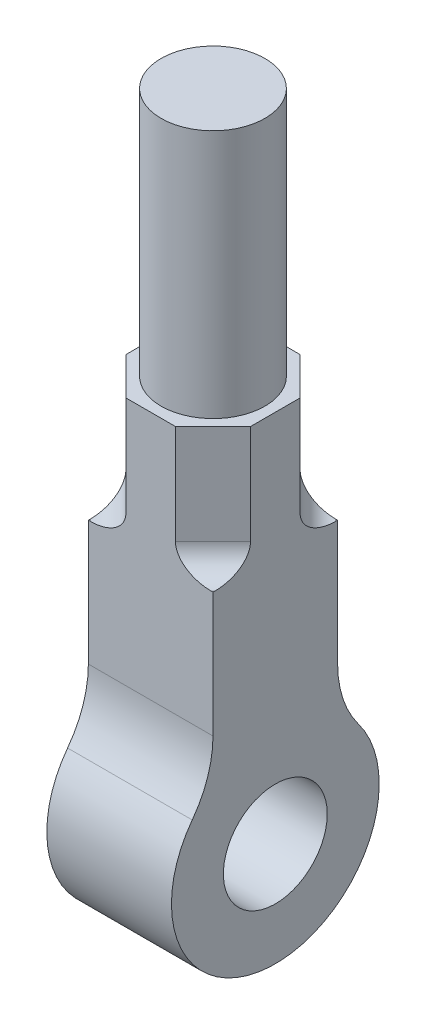
ISO-10303-21;
HEADER;
FILE_DESCRIPTION(('STEP AP214'),'2;1');
FILE_NAME('part.step','',(''),(''),'','','');
FILE_SCHEMA(('AUTOMOTIVE_DESIGN { 1 0 10303 214 1 1 1 1 }'));
ENDSEC;
DATA;
#1=APPLICATION_CONTEXT('core data for automotive mechanical design processes');
#2=APPLICATION_PROTOCOL_DEFINITION('international standard','automotive_design',2000,#1);
#3=PRODUCT_CONTEXT('',#1,'mechanical');
#4=PRODUCT('Part','Part','',(#3));
#5=PRODUCT_RELATED_PRODUCT_CATEGORY('part','',(#4));
#6=PRODUCT_DEFINITION_FORMATION('','',#4);
#7=PRODUCT_DEFINITION_CONTEXT('part definition',#1,'design');
#8=PRODUCT_DEFINITION('design','',#6,#7);
#9=PRODUCT_DEFINITION_SHAPE('','',#8);
#10=(LENGTH_UNIT() NAMED_UNIT(*) SI_UNIT(.MILLI.,.METRE.));
#11=(NAMED_UNIT(*) PLANE_ANGLE_UNIT() SI_UNIT($,.RADIAN.));
#12=(NAMED_UNIT(*) SI_UNIT($,.STERADIAN.) SOLID_ANGLE_UNIT());
#13=UNCERTAINTY_MEASURE_WITH_UNIT(LENGTH_MEASURE(1.E-05),#10,'distance_accuracy_value','');
#14=(GEOMETRIC_REPRESENTATION_CONTEXT(3) GLOBAL_UNCERTAINTY_ASSIGNED_CONTEXT((#13)) GLOBAL_UNIT_ASSIGNED_CONTEXT((#10,
#11,#12)) REPRESENTATION_CONTEXT('',''));
#15=CARTESIAN_POINT('',(0.,0.,0.));
#16=DIRECTION('',(0.,0.,1.));
#17=DIRECTION('',(1.,0.,0.));
#18=AXIS2_PLACEMENT_3D('',#15,#16,#17);
#19=CARTESIAN_POINT('',(60.,60.,-80.));
#20=DIRECTION('',(-1.,0.,0.));
#21=DIRECTION('',(0.,0.,1.));
#22=AXIS2_PLACEMENT_3D('',#19,#20,#21);
#23=PLANE('',#22);
#24=DIRECTION('',(0.,0.,-1.));
#25=VECTOR('',#24,1.);
#26=CARTESIAN_POINT('',(60.,120.,0.));
#27=LINE('',#26,#25);
#28=CARTESIAN_POINT('',(60.,120.,-28.9105627484772));
#29=VERTEX_POINT('',#28);
#30=CARTESIAN_POINT('',(60.,120.,-30.));
#31=VERTEX_POINT('',#30);
#32=EDGE_CURVE('E297',#29,#31,#27,.T.);
#33=ORIENTED_EDGE('',*,*,#32,.F.);
#34=CARTESIAN_POINT('',(60.,132.,-28.9105627484772));
#35=DIRECTION('',(-1.,0.,0.));
#36=DIRECTION('',(0.,0.,1.));
#37=AXIS2_PLACEMENT_3D('',#34,#35,#36);
#38=ELLIPSE('',#37,16.9705627484771,12.);
#39=CARTESIAN_POINT('',(60.,132.,-11.94));
#40=VERTEX_POINT('',#39);
#41=EDGE_CURVE('E254',#29,#40,#38,.T.);
#42=ORIENTED_EDGE('',*,*,#41,.T.);
#43=DIRECTION('',(0.,1.,0.));
#44=VECTOR('',#43,1.);
#45=CARTESIAN_POINT('',(60.,120.,-11.94));
#46=LINE('',#45,#44);
#47=CARTESIAN_POINT('',(60.,180.,-11.94));
#48=VERTEX_POINT('',#47);
#49=EDGE_CURVE('E288',#40,#48,#46,.T.);
#50=ORIENTED_EDGE('',*,*,#49,.T.);
#51=DIRECTION('',(0.,0.,1.));
#52=VECTOR('',#51,1.);
#53=CARTESIAN_POINT('',(60.,180.,30.));
#54=LINE('',#53,#52);
#55=CARTESIAN_POINT('',(60.,180.,11.94));
#56=VERTEX_POINT('',#55);
#57=EDGE_CURVE('E341',#48,#56,#54,.T.);
#58=ORIENTED_EDGE('',*,*,#57,.T.);
#59=DIRECTION('',(0.,1.,0.));
#60=VECTOR('',#59,1.);
#61=CARTESIAN_POINT('',(60.,120.,11.94));
#62=LINE('',#61,#60);
#63=CARTESIAN_POINT('',(60.,132.,11.94));
#64=VERTEX_POINT('',#63);
#65=EDGE_CURVE('E316',#64,#56,#62,.T.);
#66=ORIENTED_EDGE('',*,*,#65,.F.);
#67=CARTESIAN_POINT('',(60.,132.,28.9105627484771));
#68=DIRECTION('',(-1.,0.,0.));
#69=DIRECTION('',(0.,0.,1.));
#70=AXIS2_PLACEMENT_3D('',#67,#68,#69);
#71=ELLIPSE('',#70,16.9705627484771,12.);
#72=CARTESIAN_POINT('',(60.,120.,28.9105627484771));
#73=VERTEX_POINT('',#72);
#74=EDGE_CURVE('E11',#64,#73,#71,.T.);
#75=ORIENTED_EDGE('',*,*,#74,.T.);
#76=DIRECTION('',(0.,0.,-1.));
#77=VECTOR('',#76,1.);
#78=CARTESIAN_POINT('',(60.,120.,0.));
#79=LINE('',#78,#77);
#80=CARTESIAN_POINT('',(60.,120.,30.));
#81=VERTEX_POINT('',#80);
#82=EDGE_CURVE('E309',#81,#73,#79,.T.);
#83=ORIENTED_EDGE('',*,*,#82,.F.);
#84=DIRECTION('',(0.,-1.,0.));
#85=VECTOR('',#84,1.);
#86=CARTESIAN_POINT('',(60.,60.,30.));
#87=LINE('',#86,#85);
#88=CARTESIAN_POINT('',(60.,60.,30.));
#89=VERTEX_POINT('',#88);
#90=EDGE_CURVE('E345',#81,#89,#87,.T.);
#91=ORIENTED_EDGE('',*,*,#90,.T.);
#92=CARTESIAN_POINT('',(60.,60.,80.));
#93=DIRECTION('',(-1.,0.,0.));
#94=DIRECTION('',(0.,0.,-1.));
#95=AXIS2_PLACEMENT_3D('',#92,#93,#94);
#96=CIRCLE('',#95,50.);
#97=CARTESIAN_POINT('',(60.,30.,40.));
#98=VERTEX_POINT('',#97);
#99=EDGE_CURVE('E348',#89,#98,#96,.T.);
#100=ORIENTED_EDGE('',*,*,#99,.T.);
#101=CARTESIAN_POINT('',(60.,0.,0.));
#102=DIRECTION('',(1.,0.,0.));
#103=DIRECTION('',(0.,0.,-1.));
#104=AXIS2_PLACEMENT_3D('',#101,#102,#103);
#105=CIRCLE('',#104,50.);
#106=CARTESIAN_POINT('',(60.,30.,-40.));
#107=VERTEX_POINT('',#106);
#108=EDGE_CURVE('E351',#98,#107,#105,.T.);
#109=ORIENTED_EDGE('',*,*,#108,.T.);
#110=CARTESIAN_POINT('',(60.,60.,-80.));
#111=DIRECTION('',(-1.,0.,0.));
#112=DIRECTION('',(0.,0.,1.));
#113=AXIS2_PLACEMENT_3D('',#110,#111,#112);
#114=CIRCLE('',#113,50.);
#115=CARTESIAN_POINT('',(60.,60.,-30.));
#116=VERTEX_POINT('',#115);
#117=EDGE_CURVE('E332',#107,#116,#114,.T.);
#118=ORIENTED_EDGE('',*,*,#117,.T.);
#119=DIRECTION('',(0.,1.,0.));
#120=VECTOR('',#119,1.);
#121=CARTESIAN_POINT('',(60.,60.,-30.));
#122=LINE('',#121,#120);
#123=EDGE_CURVE('E336',#116,#31,#122,.T.);
#124=ORIENTED_EDGE('',*,*,#123,.T.);
#125=EDGE_LOOP('',(#33,#42,#50,#58,#66,#75,#83,#91,#100,#109,#118,#124));
#126=FACE_BOUND('',#125,.T.);
#127=CARTESIAN_POINT('',(60.,0.,0.));
#128=DIRECTION('',(1.,0.,0.));
#129=DIRECTION('',(0.,0.,-1.));
#130=AXIS2_PLACEMENT_3D('',#127,#128,#129);
#131=CIRCLE('',#130,25.);
#132=CARTESIAN_POINT('',(60.,0.,-25.));
#133=VERTEX_POINT('',#132);
#134=EDGE_CURVE('E324',#133,#133,#131,.T.);
#135=ORIENTED_EDGE('',*,*,#134,.F.);
#136=EDGE_LOOP('',(#135));
#137=FACE_BOUND('',#136,.T.);
#138=ADVANCED_FACE('F44',(#126,#137),#23,.F.);
#139=CARTESIAN_POINT('',(0.,60.,-80.));
#140=DIRECTION('',(-1.,0.,0.));
#141=DIRECTION('',(0.,0.,1.));
#142=AXIS2_PLACEMENT_3D('',#139,#140,#141);
#143=PLANE('',#142);
#144=DIRECTION('',(0.,1.,0.));
#145=VECTOR('',#144,1.);
#146=CARTESIAN_POINT('',(0.,120.,-11.94));
#147=LINE('',#146,#145);
#148=CARTESIAN_POINT('',(0.,132.,-11.94));
#149=VERTEX_POINT('',#148);
#150=CARTESIAN_POINT('',(0.,180.,-11.94));
#151=VERTEX_POINT('',#150);
#152=EDGE_CURVE('E284',#149,#151,#147,.T.);
#153=ORIENTED_EDGE('',*,*,#152,.F.);
#154=CARTESIAN_POINT('',(0.,132.,-28.9105627484771));
#155=DIRECTION('',(-1.,0.,0.));
#156=DIRECTION('',(0.,0.,-1.));
#157=AXIS2_PLACEMENT_3D('',#154,#155,#156);
#158=ELLIPSE('',#157,16.9705627484771,12.);
#159=CARTESIAN_POINT('',(0.,120.,-28.9105627484771));
#160=VERTEX_POINT('',#159);
#161=EDGE_CURVE('E245',#149,#160,#158,.F.);
#162=ORIENTED_EDGE('',*,*,#161,.T.);
#163=DIRECTION('',(0.,0.,1.));
#164=VECTOR('',#163,1.);
#165=CARTESIAN_POINT('',(0.,120.,0.));
#166=LINE('',#165,#164);
#167=CARTESIAN_POINT('',(0.,120.,-30.));
#168=VERTEX_POINT('',#167);
#169=EDGE_CURVE('E276',#168,#160,#166,.T.);
#170=ORIENTED_EDGE('',*,*,#169,.F.);
#171=DIRECTION('',(0.,1.,0.));
#172=VECTOR('',#171,1.);
#173=CARTESIAN_POINT('',(0.,60.,-30.));
#174=LINE('',#173,#172);
#175=CARTESIAN_POINT('',(0.,60.,-30.));
#176=VERTEX_POINT('',#175);
#177=EDGE_CURVE('E358',#176,#168,#174,.T.);
#178=ORIENTED_EDGE('',*,*,#177,.F.);
#179=CARTESIAN_POINT('',(0.,60.,-80.));
#180=DIRECTION('',(-1.,0.,0.));
#181=DIRECTION('',(0.,0.,1.));
#182=AXIS2_PLACEMENT_3D('',#179,#180,#181);
#183=CIRCLE('',#182,50.);
#184=CARTESIAN_POINT('',(0.,30.,-40.));
#185=VERTEX_POINT('',#184);
#186=EDGE_CURVE('E328',#185,#176,#183,.T.);
#187=ORIENTED_EDGE('',*,*,#186,.F.);
#188=CARTESIAN_POINT('',(0.,0.,0.));
#189=DIRECTION('',(1.,0.,0.));
#190=DIRECTION('',(0.,0.,-1.));
#191=AXIS2_PLACEMENT_3D('',#188,#189,#190);
#192=CIRCLE('',#191,50.);
#193=CARTESIAN_POINT('',(0.,30.,40.));
#194=VERTEX_POINT('',#193);
#195=EDGE_CURVE('E337',#194,#185,#192,.T.);
#196=ORIENTED_EDGE('',*,*,#195,.F.);
#197=CARTESIAN_POINT('',(0.,60.,80.));
#198=DIRECTION('',(-1.,0.,0.));
#199=DIRECTION('',(0.,0.,-1.));
#200=AXIS2_PLACEMENT_3D('',#197,#198,#199);
#201=CIRCLE('',#200,50.);
#202=CARTESIAN_POINT('',(0.,60.,30.));
#203=VERTEX_POINT('',#202);
#204=EDGE_CURVE('E367',#203,#194,#201,.T.);
#205=ORIENTED_EDGE('',*,*,#204,.F.);
#206=DIRECTION('',(0.,-1.,0.));
#207=VECTOR('',#206,1.);
#208=CARTESIAN_POINT('',(0.,60.,30.));
#209=LINE('',#208,#207);
#210=CARTESIAN_POINT('',(0.,120.,30.));
#211=VERTEX_POINT('',#210);
#212=EDGE_CURVE('E364',#211,#203,#209,.T.);
#213=ORIENTED_EDGE('',*,*,#212,.F.);
#214=DIRECTION('',(0.,0.,1.));
#215=VECTOR('',#214,1.);
#216=CARTESIAN_POINT('',(0.,120.,0.));
#217=LINE('',#216,#215);
#218=CARTESIAN_POINT('',(0.,120.,28.9105627484771));
#219=VERTEX_POINT('',#218);
#220=EDGE_CURVE('E180',#219,#211,#217,.T.);
#221=ORIENTED_EDGE('',*,*,#220,.F.);
#222=CARTESIAN_POINT('',(0.,132.,28.9105627484771));
#223=DIRECTION('',(-1.,0.,0.));
#224=DIRECTION('',(0.,0.,-1.));
#225=AXIS2_PLACEMENT_3D('',#222,#223,#224);
#226=ELLIPSE('',#225,16.9705627484771,12.);
#227=CARTESIAN_POINT('',(0.,132.,11.94));
#228=VERTEX_POINT('',#227);
#229=EDGE_CURVE('E248',#219,#228,#226,.F.);
#230=ORIENTED_EDGE('',*,*,#229,.T.);
#231=DIRECTION('',(0.,1.,0.));
#232=VECTOR('',#231,1.);
#233=CARTESIAN_POINT('',(0.,120.,11.94));
#234=LINE('',#233,#232);
#235=CARTESIAN_POINT('',(0.,180.,11.94));
#236=VERTEX_POINT('',#235);
#237=EDGE_CURVE('E179',#228,#236,#234,.T.);
#238=ORIENTED_EDGE('',*,*,#237,.T.);
#239=DIRECTION('',(0.,0.,1.));
#240=VECTOR('',#239,1.);
#241=CARTESIAN_POINT('',(0.,180.,30.));
#242=LINE('',#241,#240);
#243=EDGE_CURVE('E190',#151,#236,#242,.T.);
#244=ORIENTED_EDGE('',*,*,#243,.F.);
#245=EDGE_LOOP('',(#153,#162,#170,#178,#187,#196,#205,#213,#221,#230,#238,#244));
#246=FACE_BOUND('',#245,.T.);
#247=CARTESIAN_POINT('',(0.,0.,0.));
#248=DIRECTION('',(1.,0.,0.));
#249=DIRECTION('',(0.,0.,-1.));
#250=AXIS2_PLACEMENT_3D('',#247,#248,#249);
#251=CIRCLE('',#250,25.);
#252=CARTESIAN_POINT('',(0.,0.,-25.));
#253=VERTEX_POINT('',#252);
#254=EDGE_CURVE('E321',#253,#253,#251,.T.);
#255=ORIENTED_EDGE('',*,*,#254,.T.);
#256=EDGE_LOOP('',(#255));
#257=FACE_BOUND('',#256,.T.);
#258=ADVANCED_FACE('F388',(#246,#257),#143,.T.);
#259=CARTESIAN_POINT('',(60.,60.,-80.));
#260=DIRECTION('',(-1.,0.,0.));
#261=DIRECTION('',(0.,0.,1.));
#262=AXIS2_PLACEMENT_3D('',#259,#260,#261);
#263=CYLINDRICAL_SURFACE('',#262,50.);
#264=ORIENTED_EDGE('',*,*,#186,.T.);
#265=DIRECTION('',(-1.,0.,0.));
#266=VECTOR('',#265,1.);
#267=CARTESIAN_POINT('',(60.,60.,-30.));
#268=LINE('',#267,#266);
#269=EDGE_CURVE('E205',#116,#176,#268,.T.);
#270=ORIENTED_EDGE('',*,*,#269,.F.);
#271=ORIENTED_EDGE('',*,*,#117,.F.);
#272=DIRECTION('',(-1.,0.,0.));
#273=VECTOR('',#272,1.);
#274=CARTESIAN_POINT('',(60.,30.,-40.));
#275=LINE('',#274,#273);
#276=EDGE_CURVE('E354',#107,#185,#275,.T.);
#277=ORIENTED_EDGE('',*,*,#276,.T.);
#278=EDGE_LOOP('',(#264,#270,#271,#277));
#279=FACE_BOUND('',#278,.T.);
#280=ADVANCED_FACE('F394',(#279),#263,.F.);
#281=CARTESIAN_POINT('',(60.,60.,-30.));
#282=DIRECTION('',(0.,0.,1.));
#283=DIRECTION('',(1.,0.,0.));
#284=AXIS2_PLACEMENT_3D('',#281,#282,#283);
#285=PLANE('',#284);
#286=DIRECTION('',(-1.,0.,0.));
#287=VECTOR('',#286,1.);
#288=CARTESIAN_POINT('',(60.,180.,-30.));
#289=LINE('',#288,#287);
#290=CARTESIAN_POINT('',(41.94,180.,-30.));
#291=VERTEX_POINT('',#290);
#292=CARTESIAN_POINT('',(18.06,180.,-30.));
#293=VERTEX_POINT('',#292);
#294=EDGE_CURVE('E199',#291,#293,#289,.T.);
#295=ORIENTED_EDGE('',*,*,#294,.F.);
#296=DIRECTION('',(0.,1.,0.));
#297=VECTOR('',#296,1.);
#298=CARTESIAN_POINT('',(41.94,120.,-30.));
#299=LINE('',#298,#297);
#300=CARTESIAN_POINT('',(41.94,132.,-30.));
#301=VERTEX_POINT('',#300);
#302=EDGE_CURVE('E301',#301,#291,#299,.T.);
#303=ORIENTED_EDGE('',*,*,#302,.F.);
#304=CARTESIAN_POINT('',(58.9105627484772,132.,-30.));
#305=DIRECTION('',(0.,0.,1.));
#306=DIRECTION('',(1.,0.,0.));
#307=AXIS2_PLACEMENT_3D('',#304,#305,#306);
#308=ELLIPSE('',#307,16.9705627484771,12.);
#309=CARTESIAN_POINT('',(58.9105627484772,120.,-30.));
#310=VERTEX_POINT('',#309);
#311=EDGE_CURVE('E257',#301,#310,#308,.T.);
#312=ORIENTED_EDGE('',*,*,#311,.T.);
#313=DIRECTION('',(-1.,0.,0.));
#314=VECTOR('',#313,1.);
#315=CARTESIAN_POINT('',(0.,120.,-30.));
#316=LINE('',#315,#314);
#317=EDGE_CURVE('E293',#31,#310,#316,.T.);
#318=ORIENTED_EDGE('',*,*,#317,.F.);
#319=ORIENTED_EDGE('',*,*,#123,.F.);
#320=ORIENTED_EDGE('',*,*,#269,.T.);
#321=ORIENTED_EDGE('',*,*,#177,.T.);
#322=DIRECTION('',(-1.,0.,0.));
#323=VECTOR('',#322,1.);
#324=CARTESIAN_POINT('',(0.,120.,-30.));
#325=LINE('',#324,#323);
#326=CARTESIAN_POINT('',(1.08943725152286,120.,-30.));
#327=VERTEX_POINT('',#326);
#328=EDGE_CURVE('E280',#327,#168,#325,.T.);
#329=ORIENTED_EDGE('',*,*,#328,.F.);
#330=CARTESIAN_POINT('',(1.08943725152286,132.,-30.));
#331=DIRECTION('',(0.,0.,1.));
#332=DIRECTION('',(1.,0.,0.));
#333=AXIS2_PLACEMENT_3D('',#330,#331,#332);
#334=ELLIPSE('',#333,16.9705627484771,12.);
#335=CARTESIAN_POINT('',(18.06,132.,-30.));
#336=VERTEX_POINT('',#335);
#337=EDGE_CURVE('E242',#327,#336,#334,.T.);
#338=ORIENTED_EDGE('',*,*,#337,.T.);
#339=DIRECTION('',(0.,1.,0.));
#340=VECTOR('',#339,1.);
#341=CARTESIAN_POINT('',(18.06,120.,-30.));
#342=LINE('',#341,#340);
#343=EDGE_CURVE('E193',#336,#293,#342,.T.);
#344=ORIENTED_EDGE('',*,*,#343,.T.);
#345=EDGE_LOOP('',(#295,#303,#312,#318,#319,#320,#321,#329,#338,#344));
#346=FACE_BOUND('',#345,.T.);
#347=ADVANCED_FACE('F441',(#346),#285,.F.);
#348=CARTESIAN_POINT('',(60.,180.,30.));
#349=DIRECTION('',(0.,-1.,0.));
#350=DIRECTION('',(0.,0.,-1.));
#351=AXIS2_PLACEMENT_3D('',#348,#349,#350);
#352=PLANE('',#351);
#353=CARTESIAN_POINT('',(30.,180.,0.));
#354=DIRECTION('',(0.,1.,0.));
#355=DIRECTION('',(0.,0.,1.));
#356=AXIS2_PLACEMENT_3D('',#353,#354,#355);
#357=CIRCLE('',#356,25.);
#358=CARTESIAN_POINT('',(30.,180.,25.));
#359=VERTEX_POINT('',#358);
#360=EDGE_CURVE('E215',#359,#359,#357,.T.);
#361=ORIENTED_EDGE('',*,*,#360,.F.);
#362=EDGE_LOOP('',(#361));
#363=FACE_BOUND('',#362,.T.);
#364=ORIENTED_EDGE('',*,*,#57,.F.);
#365=DIRECTION('',(0.707106781186548,0.,0.707106781186547));
#366=VECTOR('',#365,1.);
#367=CARTESIAN_POINT('',(35.97,180.,-35.97));
#368=LINE('',#367,#366);
#369=EDGE_CURVE('E298',#291,#48,#368,.T.);
#370=ORIENTED_EDGE('',*,*,#369,.F.);
#371=ORIENTED_EDGE('',*,*,#294,.T.);
#372=DIRECTION('',(0.707106781186547,0.,-0.707106781186548));
#373=VECTOR('',#372,1.);
#374=CARTESIAN_POINT('',(-5.97,180.,-5.97));
#375=LINE('',#374,#373);
#376=EDGE_CURVE('E281',#151,#293,#375,.T.);
#377=ORIENTED_EDGE('',*,*,#376,.F.);
#378=ORIENTED_EDGE('',*,*,#243,.T.);
#379=DIRECTION('',(-0.707106781186548,0.,-0.707106781186548));
#380=VECTOR('',#379,1.);
#381=CARTESIAN_POINT('',(-5.97,180.,5.97));
#382=LINE('',#381,#380);
#383=CARTESIAN_POINT('',(18.06,180.,30.));
#384=VERTEX_POINT('',#383);
#385=EDGE_CURVE('E172',#384,#236,#382,.T.);
#386=ORIENTED_EDGE('',*,*,#385,.F.);
#387=DIRECTION('',(-1.,0.,0.));
#388=VECTOR('',#387,1.);
#389=CARTESIAN_POINT('',(60.,180.,30.));
#390=LINE('',#389,#388);
#391=CARTESIAN_POINT('',(41.94,180.,30.));
#392=VERTEX_POINT('',#391);
#393=EDGE_CURVE('E187',#392,#384,#390,.T.);
#394=ORIENTED_EDGE('',*,*,#393,.F.);
#395=DIRECTION('',(-0.707106781186547,0.,0.707106781186548));
#396=VECTOR('',#395,1.);
#397=CARTESIAN_POINT('',(35.97,180.,35.97));
#398=LINE('',#397,#396);
#399=EDGE_CURVE('E274',#56,#392,#398,.T.);
#400=ORIENTED_EDGE('',*,*,#399,.F.);
#401=EDGE_LOOP('',(#364,#370,#371,#377,#378,#386,#394,#400));
#402=FACE_BOUND('',#401,.T.);
#403=ADVANCED_FACE('F185',(#363,#402),#352,.F.);
#404=CARTESIAN_POINT('',(60.,60.,30.));
#405=DIRECTION('',(0.,0.,-1.));
#406=DIRECTION('',(-1.,0.,0.));
#407=AXIS2_PLACEMENT_3D('',#404,#405,#406);
#408=PLANE('',#407);
#409=ORIENTED_EDGE('',*,*,#393,.T.);
#410=DIRECTION('',(0.,1.,0.));
#411=VECTOR('',#410,1.);
#412=CARTESIAN_POINT('',(18.06,120.,30.));
#413=LINE('',#412,#411);
#414=CARTESIAN_POINT('',(18.06,132.,30.));
#415=VERTEX_POINT('',#414);
#416=EDGE_CURVE('E168',#415,#384,#413,.T.);
#417=ORIENTED_EDGE('',*,*,#416,.F.);
#418=CARTESIAN_POINT('',(1.08943725152286,132.,30.));
#419=DIRECTION('',(0.,0.,-1.));
#420=DIRECTION('',(-1.,0.,0.));
#421=AXIS2_PLACEMENT_3D('',#418,#419,#420);
#422=ELLIPSE('',#421,16.9705627484771,12.);
#423=CARTESIAN_POINT('',(1.08943725152286,120.,30.));
#424=VERTEX_POINT('',#423);
#425=EDGE_CURVE('E251',#415,#424,#422,.T.);
#426=ORIENTED_EDGE('',*,*,#425,.T.);
#427=DIRECTION('',(1.,0.,0.));
#428=VECTOR('',#427,1.);
#429=CARTESIAN_POINT('',(0.,120.,30.));
#430=LINE('',#429,#428);
#431=EDGE_CURVE('E192',#211,#424,#430,.T.);
#432=ORIENTED_EDGE('',*,*,#431,.F.);
#433=ORIENTED_EDGE('',*,*,#212,.T.);
#434=DIRECTION('',(-1.,0.,0.));
#435=VECTOR('',#434,1.);
#436=CARTESIAN_POINT('',(60.,60.,30.));
#437=LINE('',#436,#435);
#438=EDGE_CURVE('E200',#89,#203,#437,.T.);
#439=ORIENTED_EDGE('',*,*,#438,.F.);
#440=ORIENTED_EDGE('',*,*,#90,.F.);
#441=DIRECTION('',(1.,0.,0.));
#442=VECTOR('',#441,1.);
#443=CARTESIAN_POINT('',(0.,120.,30.));
#444=LINE('',#443,#442);
#445=CARTESIAN_POINT('',(58.9105627484771,120.,30.));
#446=VERTEX_POINT('',#445);
#447=EDGE_CURVE('E313',#446,#81,#444,.T.);
#448=ORIENTED_EDGE('',*,*,#447,.F.);
#449=CARTESIAN_POINT('',(58.9105627484771,132.,30.));
#450=DIRECTION('',(0.,0.,-1.));
#451=DIRECTION('',(-1.,0.,0.));
#452=AXIS2_PLACEMENT_3D('',#449,#450,#451);
#453=ELLIPSE('',#452,16.9705627484771,12.);
#454=CARTESIAN_POINT('',(41.94,132.,30.));
#455=VERTEX_POINT('',#454);
#456=EDGE_CURVE('E53',#446,#455,#453,.T.);
#457=ORIENTED_EDGE('',*,*,#456,.T.);
#458=DIRECTION('',(0.,1.,0.));
#459=VECTOR('',#458,1.);
#460=CARTESIAN_POINT('',(41.94,120.,30.));
#461=LINE('',#460,#459);
#462=EDGE_CURVE('E196',#455,#392,#461,.T.);
#463=ORIENTED_EDGE('',*,*,#462,.T.);
#464=EDGE_LOOP('',(#409,#417,#426,#432,#433,#439,#440,#448,#457,#463));
#465=FACE_BOUND('',#464,.T.);
#466=ADVANCED_FACE('F195',(#465),#408,.F.);
#467=CARTESIAN_POINT('',(60.,60.,80.));
#468=DIRECTION('',(-1.,0.,0.));
#469=DIRECTION('',(0.,0.,1.));
#470=AXIS2_PLACEMENT_3D('',#467,#468,#469);
#471=CYLINDRICAL_SURFACE('',#470,50.);
#472=ORIENTED_EDGE('',*,*,#204,.T.);
#473=DIRECTION('',(-1.,0.,0.));
#474=VECTOR('',#473,1.);
#475=CARTESIAN_POINT('',(60.,30.,40.));
#476=LINE('',#475,#474);
#477=EDGE_CURVE('E208',#98,#194,#476,.T.);
#478=ORIENTED_EDGE('',*,*,#477,.F.);
#479=ORIENTED_EDGE('',*,*,#99,.F.);
#480=ORIENTED_EDGE('',*,*,#438,.T.);
#481=EDGE_LOOP('',(#472,#478,#479,#480));
#482=FACE_BOUND('',#481,.T.);
#483=ADVANCED_FACE('F402',(#482),#471,.F.);
#484=CARTESIAN_POINT('',(60.,0.,0.));
#485=DIRECTION('',(-1.,0.,0.));
#486=DIRECTION('',(0.,0.,1.));
#487=AXIS2_PLACEMENT_3D('',#484,#485,#486);
#488=CYLINDRICAL_SURFACE('',#487,50.);
#489=ORIENTED_EDGE('',*,*,#195,.T.);
#490=ORIENTED_EDGE('',*,*,#276,.F.);
#491=ORIENTED_EDGE('',*,*,#108,.F.);
#492=ORIENTED_EDGE('',*,*,#477,.T.);
#493=EDGE_LOOP('',(#489,#490,#491,#492));
#494=FACE_BOUND('',#493,.T.);
#495=ADVANCED_FACE('F380',(#494),#488,.T.);
#496=CARTESIAN_POINT('',(60.,0.,0.));
#497=DIRECTION('',(-1.,0.,0.));
#498=DIRECTION('',(0.,0.,1.));
#499=AXIS2_PLACEMENT_3D('',#496,#497,#498);
#500=CYLINDRICAL_SURFACE('',#499,25.);
#501=ORIENTED_EDGE('',*,*,#134,.T.);
#502=EDGE_LOOP('',(#501));
#503=FACE_BOUND('',#502,.T.);
#504=ORIENTED_EDGE('',*,*,#254,.F.);
#505=EDGE_LOOP('',(#504));
#506=FACE_BOUND('',#505,.T.);
#507=ADVANCED_FACE('F430',(#503,#506),#500,.F.);
#508=CARTESIAN_POINT('',(35.97,120.,35.97));
#509=DIRECTION('',(-0.707106781186548,0.,-0.707106781186547));
#510=DIRECTION('',(-0.707106781186547,0.,0.707106781186548));
#511=AXIS2_PLACEMENT_3D('',#508,#509,#510);
#512=PLANE('',#511);
#513=ORIENTED_EDGE('',*,*,#462,.F.);
#514=DIRECTION('',(-0.707106781186547,0.,0.707106781186548));
#515=VECTOR('',#514,1.);
#516=CARTESIAN_POINT('',(35.97,132.,35.97));
#517=LINE('',#516,#515);
#518=EDGE_CURVE('E60',#455,#64,#517,.F.);
#519=ORIENTED_EDGE('',*,*,#518,.T.);
#520=ORIENTED_EDGE('',*,*,#65,.T.);
#521=ORIENTED_EDGE('',*,*,#399,.T.);
#522=EDGE_LOOP('',(#513,#519,#520,#521));
#523=FACE_BOUND('',#522,.T.);
#524=ADVANCED_FACE('F468',(#523),#512,.F.);
#525=CARTESIAN_POINT('',(0.,120.,0.));
#526=DIRECTION('',(0.,1.,0.));
#527=DIRECTION('',(0.,0.,1.));
#528=AXIS2_PLACEMENT_3D('',#525,#526,#527);
#529=PLANE('',#528);
#530=ORIENTED_EDGE('',*,*,#82,.T.);
#531=DIRECTION('',(-0.707106781186547,0.,0.707106781186548));
#532=VECTOR('',#531,1.);
#533=CARTESIAN_POINT('',(44.4552813742386,120.,44.4552813742386));
#534=LINE('',#533,#532);
#535=EDGE_CURVE('E236',#73,#446,#534,.T.);
#536=ORIENTED_EDGE('',*,*,#535,.T.);
#537=ORIENTED_EDGE('',*,*,#447,.T.);
#538=EDGE_LOOP('',(#530,#536,#537));
#539=FACE_BOUND('',#538,.T.);
#540=ADVANCED_FACE('F526',(#539),#529,.T.);
#541=CARTESIAN_POINT('',(-5.97,120.,5.97));
#542=DIRECTION('',(0.707106781186547,0.,-0.707106781186547));
#543=DIRECTION('',(-0.707106781186548,0.,-0.707106781186548));
#544=AXIS2_PLACEMENT_3D('',#541,#542,#543);
#545=PLANE('',#544);
#546=ORIENTED_EDGE('',*,*,#237,.F.);
#547=DIRECTION('',(-0.707106781186548,0.,-0.707106781186548));
#548=VECTOR('',#547,1.);
#549=CARTESIAN_POINT('',(-5.97,132.,5.97));
#550=LINE('',#549,#548);
#551=EDGE_CURVE('E175',#228,#415,#550,.F.);
#552=ORIENTED_EDGE('',*,*,#551,.T.);
#553=ORIENTED_EDGE('',*,*,#416,.T.);
#554=ORIENTED_EDGE('',*,*,#385,.T.);
#555=EDGE_LOOP('',(#546,#552,#553,#554));
#556=FACE_BOUND('',#555,.T.);
#557=ADVANCED_FACE('F171',(#556),#545,.F.);
#558=CARTESIAN_POINT('',(0.,120.,0.));
#559=DIRECTION('',(0.,1.,0.));
#560=DIRECTION('',(0.,0.,1.));
#561=AXIS2_PLACEMENT_3D('',#558,#559,#560);
#562=PLANE('',#561);
#563=ORIENTED_EDGE('',*,*,#431,.T.);
#564=DIRECTION('',(-0.707106781186548,0.,-0.707106781186548));
#565=VECTOR('',#564,1.);
#566=CARTESIAN_POINT('',(-14.4552813742386,120.,14.4552813742386));
#567=LINE('',#566,#565);
#568=EDGE_CURVE('E223',#424,#219,#567,.T.);
#569=ORIENTED_EDGE('',*,*,#568,.T.);
#570=ORIENTED_EDGE('',*,*,#220,.T.);
#571=EDGE_LOOP('',(#563,#569,#570));
#572=FACE_BOUND('',#571,.T.);
#573=ADVANCED_FACE('F406',(#572),#562,.T.);
#574=CARTESIAN_POINT('',(-5.97,120.,-5.97));
#575=DIRECTION('',(0.707106781186548,0.,0.707106781186547));
#576=DIRECTION('',(0.707106781186547,0.,-0.707106781186548));
#577=AXIS2_PLACEMENT_3D('',#574,#575,#576);
#578=PLANE('',#577);
#579=ORIENTED_EDGE('',*,*,#343,.F.);
#580=DIRECTION('',(0.707106781186547,0.,-0.707106781186548));
#581=VECTOR('',#580,1.);
#582=CARTESIAN_POINT('',(-5.97,132.,-5.97));
#583=LINE('',#582,#581);
#584=EDGE_CURVE('E220',#336,#149,#583,.F.);
#585=ORIENTED_EDGE('',*,*,#584,.T.);
#586=ORIENTED_EDGE('',*,*,#152,.T.);
#587=ORIENTED_EDGE('',*,*,#376,.T.);
#588=EDGE_LOOP('',(#579,#585,#586,#587));
#589=FACE_BOUND('',#588,.T.);
#590=ADVANCED_FACE('F542',(#589),#578,.F.);
#591=CARTESIAN_POINT('',(0.,120.,0.));
#592=DIRECTION('',(0.,1.,0.));
#593=DIRECTION('',(0.,0.,1.));
#594=AXIS2_PLACEMENT_3D('',#591,#592,#593);
#595=PLANE('',#594);
#596=ORIENTED_EDGE('',*,*,#169,.T.);
#597=DIRECTION('',(0.707106781186547,0.,-0.707106781186548));
#598=VECTOR('',#597,1.);
#599=CARTESIAN_POINT('',(-14.4552813742386,120.,-14.4552813742386));
#600=LINE('',#599,#598);
#601=EDGE_CURVE('E216',#160,#327,#600,.T.);
#602=ORIENTED_EDGE('',*,*,#601,.T.);
#603=ORIENTED_EDGE('',*,*,#328,.T.);
#604=EDGE_LOOP('',(#596,#602,#603));
#605=FACE_BOUND('',#604,.T.);
#606=ADVANCED_FACE('F538',(#605),#595,.T.);
#607=CARTESIAN_POINT('',(35.97,120.,-35.97));
#608=DIRECTION('',(-0.707106781186547,0.,0.707106781186548));
#609=DIRECTION('',(0.707106781186548,0.,0.707106781186547));
#610=AXIS2_PLACEMENT_3D('',#607,#608,#609);
#611=PLANE('',#610);
#612=ORIENTED_EDGE('',*,*,#49,.F.);
#613=DIRECTION('',(0.707106781186548,0.,0.707106781186547));
#614=VECTOR('',#613,1.);
#615=CARTESIAN_POINT('',(35.97,132.,-35.97));
#616=LINE('',#615,#614);
#617=EDGE_CURVE('E233',#40,#301,#616,.F.);
#618=ORIENTED_EDGE('',*,*,#617,.T.);
#619=ORIENTED_EDGE('',*,*,#302,.T.);
#620=ORIENTED_EDGE('',*,*,#369,.T.);
#621=EDGE_LOOP('',(#612,#618,#619,#620));
#622=FACE_BOUND('',#621,.T.);
#623=ADVANCED_FACE('F535',(#622),#611,.F.);
#624=CARTESIAN_POINT('',(0.,120.,0.));
#625=DIRECTION('',(0.,1.,0.));
#626=DIRECTION('',(0.,0.,1.));
#627=AXIS2_PLACEMENT_3D('',#624,#625,#626);
#628=PLANE('',#627);
#629=ORIENTED_EDGE('',*,*,#317,.T.);
#630=DIRECTION('',(0.707106781186548,0.,0.707106781186547));
#631=VECTOR('',#630,1.);
#632=CARTESIAN_POINT('',(44.4552813742386,120.,-44.4552813742386));
#633=LINE('',#632,#631);
#634=EDGE_CURVE('E229',#310,#29,#633,.T.);
#635=ORIENTED_EDGE('',*,*,#634,.T.);
#636=ORIENTED_EDGE('',*,*,#32,.T.);
#637=EDGE_LOOP('',(#629,#635,#636));
#638=FACE_BOUND('',#637,.T.);
#639=ADVANCED_FACE('F483',(#638),#628,.T.);
#640=CARTESIAN_POINT('',(30.,300.,0.));
#641=DIRECTION('',(0.,-1.,0.));
#642=DIRECTION('',(0.,0.,-1.));
#643=AXIS2_PLACEMENT_3D('',#640,#641,#642);
#644=CYLINDRICAL_SURFACE('',#643,25.);
#645=CARTESIAN_POINT('',(30.,300.,0.));
#646=DIRECTION('',(0.,1.,0.));
#647=DIRECTION('',(0.,0.,1.));
#648=AXIS2_PLACEMENT_3D('',#645,#646,#647);
#649=CIRCLE('',#648,25.);
#650=CARTESIAN_POINT('',(30.,300.,25.));
#651=VERTEX_POINT('',#650);
#652=EDGE_CURVE('E267',#651,#651,#649,.T.);
#653=ORIENTED_EDGE('',*,*,#652,.F.);
#654=EDGE_LOOP('',(#653));
#655=FACE_BOUND('',#654,.T.);
#656=ORIENTED_EDGE('',*,*,#360,.T.);
#657=EDGE_LOOP('',(#656));
#658=FACE_BOUND('',#657,.T.);
#659=ADVANCED_FACE('F480',(#655,#658),#644,.T.);
#660=CARTESIAN_POINT('',(0.,300.,0.));
#661=DIRECTION('',(0.,1.,0.));
#662=DIRECTION('',(0.,0.,1.));
#663=AXIS2_PLACEMENT_3D('',#660,#661,#662);
#664=PLANE('',#663);
#665=ORIENTED_EDGE('',*,*,#652,.T.);
#666=EDGE_LOOP('',(#665));
#667=FACE_BOUND('',#666,.T.);
#668=ADVANCED_FACE('F419',(#667),#664,.T.);
#669=CARTESIAN_POINT('',(-14.4552813742386,132.,-14.4552813742386));
#670=DIRECTION('',(0.707106781186547,0.,-0.707106781186548));
#671=DIRECTION('',(-0.707106781186548,0.,-0.707106781186547));
#672=AXIS2_PLACEMENT_3D('',#669,#670,#671);
#673=CYLINDRICAL_SURFACE('',#672,12.);
#674=ORIENTED_EDGE('',*,*,#161,.F.);
#675=ORIENTED_EDGE('',*,*,#584,.F.);
#676=ORIENTED_EDGE('',*,*,#337,.F.);
#677=ORIENTED_EDGE('',*,*,#601,.F.);
#678=EDGE_LOOP('',(#674,#675,#676,#677));
#679=FACE_BOUND('',#678,.T.);
#680=ADVANCED_FACE('F412',(#679),#673,.F.);
#681=CARTESIAN_POINT('',(-14.4552813742386,132.,14.4552813742386));
#682=DIRECTION('',(-0.707106781186548,0.,-0.707106781186548));
#683=DIRECTION('',(-0.707106781186548,0.,0.707106781186548));
#684=AXIS2_PLACEMENT_3D('',#681,#682,#683);
#685=CYLINDRICAL_SURFACE('',#684,12.);
#686=ORIENTED_EDGE('',*,*,#425,.F.);
#687=ORIENTED_EDGE('',*,*,#551,.F.);
#688=ORIENTED_EDGE('',*,*,#229,.F.);
#689=ORIENTED_EDGE('',*,*,#568,.F.);
#690=EDGE_LOOP('',(#686,#687,#688,#689));
#691=FACE_BOUND('',#690,.T.);
#692=ADVANCED_FACE('F409',(#691),#685,.F.);
#693=CARTESIAN_POINT('',(44.4552813742386,132.,-44.4552813742386));
#694=DIRECTION('',(0.707106781186548,0.,0.707106781186547));
#695=DIRECTION('',(0.707106781186547,0.,-0.707106781186548));
#696=AXIS2_PLACEMENT_3D('',#693,#694,#695);
#697=CYLINDRICAL_SURFACE('',#696,12.);
#698=ORIENTED_EDGE('',*,*,#311,.F.);
#699=ORIENTED_EDGE('',*,*,#617,.F.);
#700=ORIENTED_EDGE('',*,*,#41,.F.);
#701=ORIENTED_EDGE('',*,*,#634,.F.);
#702=EDGE_LOOP('',(#698,#699,#700,#701));
#703=FACE_BOUND('',#702,.T.);
#704=ADVANCED_FACE('F411',(#703),#697,.F.);
#705=CARTESIAN_POINT('',(44.4552813742386,132.,44.4552813742386));
#706=DIRECTION('',(-0.707106781186547,0.,0.707106781186548));
#707=DIRECTION('',(0.707106781186548,0.,0.707106781186547));
#708=AXIS2_PLACEMENT_3D('',#705,#706,#707);
#709=CYLINDRICAL_SURFACE('',#708,12.);
#710=ORIENTED_EDGE('',*,*,#74,.F.);
#711=ORIENTED_EDGE('',*,*,#518,.F.);
#712=ORIENTED_EDGE('',*,*,#456,.F.);
#713=ORIENTED_EDGE('',*,*,#535,.F.);
#714=EDGE_LOOP('',(#710,#711,#712,#713));
#715=FACE_BOUND('',#714,.T.);
#716=ADVANCED_FACE('F46',(#715),#709,.F.);
#717=CLOSED_SHELL('',(#138,#258,#280,#347,#403,#466,#483,#495,#507,#524,#540,#557,#573,#590,
#606,#623,#639,#659,#668,#680,#692,#704,#716));
#718=MANIFOLD_SOLID_BREP('B2',#717);
#719=ADVANCED_BREP_SHAPE_REPRESENTATION('',(#18,#718),#14);
#720=SHAPE_DEFINITION_REPRESENTATION(#9,#719);
ENDSEC;
END-ISO-10303-21;
